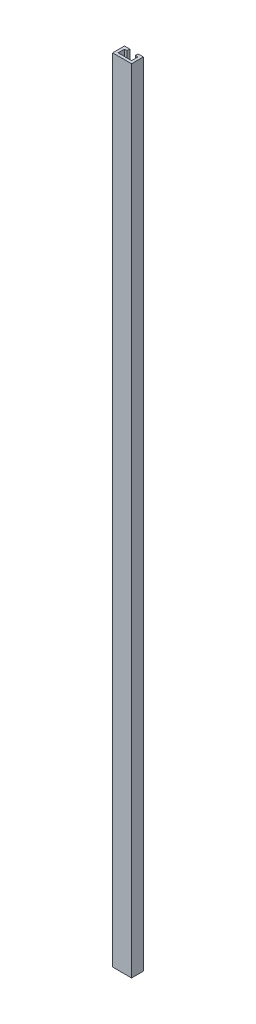
ISO-10303-21;
HEADER;
FILE_DESCRIPTION(('STEP AP214'),'2;1');
FILE_NAME('part.step','',(''),(''),'','','');
FILE_SCHEMA(('AUTOMOTIVE_DESIGN { 1 0 10303 214 1 1 1 1 }'));
ENDSEC;
DATA;
#1=APPLICATION_CONTEXT('core data for automotive mechanical design processes');
#2=APPLICATION_PROTOCOL_DEFINITION('international standard','automotive_design',2000,#1);
#3=PRODUCT_CONTEXT('',#1,'mechanical');
#4=PRODUCT('Part','Part','',(#3));
#5=PRODUCT_RELATED_PRODUCT_CATEGORY('part','',(#4));
#6=PRODUCT_DEFINITION_FORMATION('','',#4);
#7=PRODUCT_DEFINITION_CONTEXT('part definition',#1,'design');
#8=PRODUCT_DEFINITION('design','',#6,#7);
#9=PRODUCT_DEFINITION_SHAPE('','',#8);
#10=(LENGTH_UNIT() NAMED_UNIT(*) SI_UNIT(.MILLI.,.METRE.));
#11=(NAMED_UNIT(*) PLANE_ANGLE_UNIT() SI_UNIT($,.RADIAN.));
#12=(NAMED_UNIT(*) SI_UNIT($,.STERADIAN.) SOLID_ANGLE_UNIT());
#13=UNCERTAINTY_MEASURE_WITH_UNIT(LENGTH_MEASURE(1.E-05),#10,'distance_accuracy_value','');
#14=(GEOMETRIC_REPRESENTATION_CONTEXT(3) GLOBAL_UNCERTAINTY_ASSIGNED_CONTEXT((#13)) GLOBAL_UNIT_ASSIGNED_CONTEXT((#10,
#11,#12)) REPRESENTATION_CONTEXT('',''));
#15=CARTESIAN_POINT('',(0.,0.,0.));
#16=DIRECTION('',(0.,0.,1.));
#17=DIRECTION('',(1.,0.,0.));
#18=AXIS2_PLACEMENT_3D('',#15,#16,#17);
#19=CARTESIAN_POINT('',(0.,335.,0.));
#20=DIRECTION('',(1.,0.,0.));
#21=DIRECTION('',(0.,0.,-1.));
#22=AXIS2_PLACEMENT_3D('',#19,#20,#21);
#23=PLANE('',#22);
#24=DIRECTION('',(0.,0.,1.));
#25=VECTOR('',#24,1.);
#26=CARTESIAN_POINT('',(0.,0.,0.));
#27=LINE('',#26,#25);
#28=CARTESIAN_POINT('',(0.,0.,0.));
#29=VERTEX_POINT('',#28);
#30=CARTESIAN_POINT('',(0.,0.,5.));
#31=VERTEX_POINT('',#30);
#32=EDGE_CURVE('E164',#29,#31,#27,.T.);
#33=ORIENTED_EDGE('',*,*,#32,.T.);
#34=DIRECTION('',(0.,-1.,0.));
#35=VECTOR('',#34,1.);
#36=CARTESIAN_POINT('',(0.,335.,5.));
#37=LINE('',#36,#35);
#38=CARTESIAN_POINT('',(0.,335.,5.));
#39=VERTEX_POINT('',#38);
#40=EDGE_CURVE('E11',#39,#31,#37,.T.);
#41=ORIENTED_EDGE('',*,*,#40,.F.);
#42=DIRECTION('',(0.,0.,1.));
#43=VECTOR('',#42,1.);
#44=CARTESIAN_POINT('',(0.,335.,0.));
#45=LINE('',#44,#43);
#46=CARTESIAN_POINT('',(0.,335.,0.));
#47=VERTEX_POINT('',#46);
#48=EDGE_CURVE('E198',#47,#39,#45,.T.);
#49=ORIENTED_EDGE('',*,*,#48,.F.);
#50=DIRECTION('',(0.,-1.,0.));
#51=VECTOR('',#50,1.);
#52=CARTESIAN_POINT('',(0.,335.,0.));
#53=LINE('',#52,#51);
#54=EDGE_CURVE('E160',#47,#29,#53,.T.);
#55=ORIENTED_EDGE('',*,*,#54,.T.);
#56=EDGE_LOOP('',(#33,#41,#49,#55));
#57=FACE_BOUND('',#56,.T.);
#58=ADVANCED_FACE('F39',(#57),#23,.F.);
#59=CARTESIAN_POINT('',(0.,335.,5.));
#60=DIRECTION('',(0.,0.,-1.));
#61=DIRECTION('',(-1.,0.,0.));
#62=AXIS2_PLACEMENT_3D('',#59,#60,#61);
#63=PLANE('',#62);
#64=DIRECTION('',(1.,0.,0.));
#65=VECTOR('',#64,1.);
#66=CARTESIAN_POINT('',(0.,0.,5.));
#67=LINE('',#66,#65);
#68=CARTESIAN_POINT('',(8.,0.,5.));
#69=VERTEX_POINT('',#68);
#70=EDGE_CURVE('E168',#31,#69,#67,.T.);
#71=ORIENTED_EDGE('',*,*,#70,.T.);
#72=DIRECTION('',(0.,-1.,0.));
#73=VECTOR('',#72,1.);
#74=CARTESIAN_POINT('',(8.,335.,5.));
#75=LINE('',#74,#73);
#76=CARTESIAN_POINT('',(8.,335.,5.));
#77=VERTEX_POINT('',#76);
#78=EDGE_CURVE('E48',#77,#69,#75,.T.);
#79=ORIENTED_EDGE('',*,*,#78,.F.);
#80=DIRECTION('',(1.,0.,0.));
#81=VECTOR('',#80,1.);
#82=CARTESIAN_POINT('',(0.,335.,5.));
#83=LINE('',#82,#81);
#84=EDGE_CURVE('E111',#39,#77,#83,.T.);
#85=ORIENTED_EDGE('',*,*,#84,.F.);
#86=ORIENTED_EDGE('',*,*,#40,.T.);
#87=EDGE_LOOP('',(#71,#79,#85,#86));
#88=FACE_BOUND('',#87,.T.);
#89=ADVANCED_FACE('F292',(#88),#63,.F.);
#90=CARTESIAN_POINT('',(8.,335.,5.));
#91=DIRECTION('',(-1.,0.,0.));
#92=DIRECTION('',(0.,0.,1.));
#93=AXIS2_PLACEMENT_3D('',#90,#91,#92);
#94=PLANE('',#93);
#95=DIRECTION('',(0.,0.,-1.));
#96=VECTOR('',#95,1.);
#97=CARTESIAN_POINT('',(8.,0.,5.));
#98=LINE('',#97,#96);
#99=CARTESIAN_POINT('',(8.,0.,0.));
#100=VERTEX_POINT('',#99);
#101=EDGE_CURVE('E171',#69,#100,#98,.T.);
#102=ORIENTED_EDGE('',*,*,#101,.T.);
#103=DIRECTION('',(0.,-1.,0.));
#104=VECTOR('',#103,1.);
#105=CARTESIAN_POINT('',(8.,335.,0.));
#106=LINE('',#105,#104);
#107=CARTESIAN_POINT('',(8.,335.,0.));
#108=VERTEX_POINT('',#107);
#109=EDGE_CURVE('E225',#108,#100,#106,.T.);
#110=ORIENTED_EDGE('',*,*,#109,.F.);
#111=DIRECTION('',(0.,0.,-1.));
#112=VECTOR('',#111,1.);
#113=CARTESIAN_POINT('',(8.,335.,5.));
#114=LINE('',#113,#112);
#115=EDGE_CURVE('E235',#77,#108,#114,.T.);
#116=ORIENTED_EDGE('',*,*,#115,.F.);
#117=ORIENTED_EDGE('',*,*,#78,.T.);
#118=EDGE_LOOP('',(#102,#110,#116,#117));
#119=FACE_BOUND('',#118,.T.);
#120=ADVANCED_FACE('F233',(#119),#94,.F.);
#121=CARTESIAN_POINT('',(8.,335.,0.));
#122=DIRECTION('',(0.,0.,1.));
#123=DIRECTION('',(1.,0.,0.));
#124=AXIS2_PLACEMENT_3D('',#121,#122,#123);
#125=PLANE('',#124);
#126=DIRECTION('',(-1.,0.,0.));
#127=VECTOR('',#126,1.);
#128=CARTESIAN_POINT('',(8.,0.,0.));
#129=LINE('',#128,#127);
#130=CARTESIAN_POINT('',(5.75,0.,0.));
#131=VERTEX_POINT('',#130);
#132=EDGE_CURVE('E174',#100,#131,#129,.T.);
#133=ORIENTED_EDGE('',*,*,#132,.T.);
#134=DIRECTION('',(0.,-1.,0.));
#135=VECTOR('',#134,1.);
#136=CARTESIAN_POINT('',(5.75,335.,0.));
#137=LINE('',#136,#135);
#138=CARTESIAN_POINT('',(5.75,335.,0.));
#139=VERTEX_POINT('',#138);
#140=EDGE_CURVE('E221',#139,#131,#137,.T.);
#141=ORIENTED_EDGE('',*,*,#140,.F.);
#142=DIRECTION('',(-1.,0.,0.));
#143=VECTOR('',#142,1.);
#144=CARTESIAN_POINT('',(8.,335.,0.));
#145=LINE('',#144,#143);
#146=EDGE_CURVE('E254',#108,#139,#145,.T.);
#147=ORIENTED_EDGE('',*,*,#146,.F.);
#148=ORIENTED_EDGE('',*,*,#109,.T.);
#149=EDGE_LOOP('',(#133,#141,#147,#148));
#150=FACE_BOUND('',#149,.T.);
#151=ADVANCED_FACE('F244',(#150),#125,.F.);
#152=CARTESIAN_POINT('',(5.75,335.,0.));
#153=DIRECTION('',(1.,0.,0.));
#154=DIRECTION('',(0.,0.,-1.));
#155=AXIS2_PLACEMENT_3D('',#152,#153,#154);
#156=PLANE('',#155);
#157=DIRECTION('',(0.,0.,1.));
#158=VECTOR('',#157,1.);
#159=CARTESIAN_POINT('',(5.75,0.,0.));
#160=LINE('',#159,#158);
#161=CARTESIAN_POINT('',(5.75,0.,1.15));
#162=VERTEX_POINT('',#161);
#163=EDGE_CURVE('E177',#131,#162,#160,.T.);
#164=ORIENTED_EDGE('',*,*,#163,.T.);
#165=DIRECTION('',(0.,-1.,0.));
#166=VECTOR('',#165,1.);
#167=CARTESIAN_POINT('',(5.75,335.,1.15));
#168=LINE('',#167,#166);
#169=CARTESIAN_POINT('',(5.75,335.,1.15));
#170=VERTEX_POINT('',#169);
#171=EDGE_CURVE('E217',#170,#162,#168,.T.);
#172=ORIENTED_EDGE('',*,*,#171,.F.);
#173=DIRECTION('',(0.,0.,1.));
#174=VECTOR('',#173,1.);
#175=CARTESIAN_POINT('',(5.75,335.,0.));
#176=LINE('',#175,#174);
#177=EDGE_CURVE('E250',#139,#170,#176,.T.);
#178=ORIENTED_EDGE('',*,*,#177,.F.);
#179=ORIENTED_EDGE('',*,*,#140,.T.);
#180=EDGE_LOOP('',(#164,#172,#178,#179));
#181=FACE_BOUND('',#180,.T.);
#182=ADVANCED_FACE('F248',(#181),#156,.F.);
#183=CARTESIAN_POINT('',(5.75,335.,1.15));
#184=DIRECTION('',(0.,0.,-1.));
#185=DIRECTION('',(-1.,0.,0.));
#186=AXIS2_PLACEMENT_3D('',#183,#184,#185);
#187=PLANE('',#186);
#188=DIRECTION('',(1.,0.,0.));
#189=VECTOR('',#188,1.);
#190=CARTESIAN_POINT('',(5.75,0.,1.15));
#191=LINE('',#190,#189);
#192=CARTESIAN_POINT('',(6.85,0.,1.15));
#193=VERTEX_POINT('',#192);
#194=EDGE_CURVE('E180',#162,#193,#191,.T.);
#195=ORIENTED_EDGE('',*,*,#194,.T.);
#196=DIRECTION('',(0.,-1.,0.));
#197=VECTOR('',#196,1.);
#198=CARTESIAN_POINT('',(6.85,335.,1.15));
#199=LINE('',#198,#197);
#200=CARTESIAN_POINT('',(6.85,335.,1.15));
#201=VERTEX_POINT('',#200);
#202=EDGE_CURVE('E213',#201,#193,#199,.T.);
#203=ORIENTED_EDGE('',*,*,#202,.F.);
#204=DIRECTION('',(1.,0.,0.));
#205=VECTOR('',#204,1.);
#206=CARTESIAN_POINT('',(5.75,335.,1.15));
#207=LINE('',#206,#205);
#208=EDGE_CURVE('E253',#170,#201,#207,.T.);
#209=ORIENTED_EDGE('',*,*,#208,.F.);
#210=ORIENTED_EDGE('',*,*,#171,.T.);
#211=EDGE_LOOP('',(#195,#203,#209,#210));
#212=FACE_BOUND('',#211,.T.);
#213=ADVANCED_FACE('F305',(#212),#187,.F.);
#214=CARTESIAN_POINT('',(6.85,335.,1.15));
#215=DIRECTION('',(1.,0.,0.));
#216=DIRECTION('',(0.,0.,-1.));
#217=AXIS2_PLACEMENT_3D('',#214,#215,#216);
#218=PLANE('',#217);
#219=DIRECTION('',(0.,0.,1.));
#220=VECTOR('',#219,1.);
#221=CARTESIAN_POINT('',(6.85,0.,1.15));
#222=LINE('',#221,#220);
#223=CARTESIAN_POINT('',(6.85,0.,3.85));
#224=VERTEX_POINT('',#223);
#225=EDGE_CURVE('E183',#193,#224,#222,.T.);
#226=ORIENTED_EDGE('',*,*,#225,.T.);
#227=DIRECTION('',(0.,-1.,0.));
#228=VECTOR('',#227,1.);
#229=CARTESIAN_POINT('',(6.85,335.,3.85));
#230=LINE('',#229,#228);
#231=CARTESIAN_POINT('',(6.85,335.,3.85));
#232=VERTEX_POINT('',#231);
#233=EDGE_CURVE('E209',#232,#224,#230,.T.);
#234=ORIENTED_EDGE('',*,*,#233,.F.);
#235=DIRECTION('',(0.,0.,1.));
#236=VECTOR('',#235,1.);
#237=CARTESIAN_POINT('',(6.85,335.,1.15));
#238=LINE('',#237,#236);
#239=EDGE_CURVE('E258',#201,#232,#238,.T.);
#240=ORIENTED_EDGE('',*,*,#239,.F.);
#241=ORIENTED_EDGE('',*,*,#202,.T.);
#242=EDGE_LOOP('',(#226,#234,#240,#241));
#243=FACE_BOUND('',#242,.T.);
#244=ADVANCED_FACE('F308',(#243),#218,.F.);
#245=CARTESIAN_POINT('',(6.85,335.,3.85));
#246=DIRECTION('',(0.,0.,1.));
#247=DIRECTION('',(1.,0.,0.));
#248=AXIS2_PLACEMENT_3D('',#245,#246,#247);
#249=PLANE('',#248);
#250=DIRECTION('',(-1.,0.,0.));
#251=VECTOR('',#250,1.);
#252=CARTESIAN_POINT('',(6.85,0.,3.85));
#253=LINE('',#252,#251);
#254=CARTESIAN_POINT('',(1.15,0.,3.85));
#255=VERTEX_POINT('',#254);
#256=EDGE_CURVE('E186',#224,#255,#253,.T.);
#257=ORIENTED_EDGE('',*,*,#256,.T.);
#258=DIRECTION('',(0.,-1.,0.));
#259=VECTOR('',#258,1.);
#260=CARTESIAN_POINT('',(1.15,335.,3.85));
#261=LINE('',#260,#259);
#262=CARTESIAN_POINT('',(1.15,335.,3.85));
#263=VERTEX_POINT('',#262);
#264=EDGE_CURVE('E205',#263,#255,#261,.T.);
#265=ORIENTED_EDGE('',*,*,#264,.F.);
#266=DIRECTION('',(-1.,0.,0.));
#267=VECTOR('',#266,1.);
#268=CARTESIAN_POINT('',(6.85,335.,3.85));
#269=LINE('',#268,#267);
#270=EDGE_CURVE('E265',#232,#263,#269,.T.);
#271=ORIENTED_EDGE('',*,*,#270,.F.);
#272=ORIENTED_EDGE('',*,*,#233,.T.);
#273=EDGE_LOOP('',(#257,#265,#271,#272));
#274=FACE_BOUND('',#273,.T.);
#275=ADVANCED_FACE('F273',(#274),#249,.F.);
#276=CARTESIAN_POINT('',(1.15,335.,3.85));
#277=DIRECTION('',(-1.,0.,0.));
#278=DIRECTION('',(0.,0.,1.));
#279=AXIS2_PLACEMENT_3D('',#276,#277,#278);
#280=PLANE('',#279);
#281=DIRECTION('',(0.,0.,-1.));
#282=VECTOR('',#281,1.);
#283=CARTESIAN_POINT('',(1.15,0.,3.85));
#284=LINE('',#283,#282);
#285=CARTESIAN_POINT('',(1.15,0.,1.15));
#286=VERTEX_POINT('',#285);
#287=EDGE_CURVE('E189',#255,#286,#284,.T.);
#288=ORIENTED_EDGE('',*,*,#287,.T.);
#289=DIRECTION('',(0.,-1.,0.));
#290=VECTOR('',#289,1.);
#291=CARTESIAN_POINT('',(1.15,335.,1.15));
#292=LINE('',#291,#290);
#293=CARTESIAN_POINT('',(1.15,335.,1.15));
#294=VERTEX_POINT('',#293);
#295=EDGE_CURVE('E153',#294,#286,#292,.T.);
#296=ORIENTED_EDGE('',*,*,#295,.F.);
#297=DIRECTION('',(0.,0.,-1.));
#298=VECTOR('',#297,1.);
#299=CARTESIAN_POINT('',(1.15,335.,3.85));
#300=LINE('',#299,#298);
#301=EDGE_CURVE('E142',#263,#294,#300,.T.);
#302=ORIENTED_EDGE('',*,*,#301,.F.);
#303=ORIENTED_EDGE('',*,*,#264,.T.);
#304=EDGE_LOOP('',(#288,#296,#302,#303));
#305=FACE_BOUND('',#304,.T.);
#306=ADVANCED_FACE('F277',(#305),#280,.F.);
#307=CARTESIAN_POINT('',(1.15,335.,1.15));
#308=DIRECTION('',(0.,0.,-1.));
#309=DIRECTION('',(-1.,0.,0.));
#310=AXIS2_PLACEMENT_3D('',#307,#308,#309);
#311=PLANE('',#310);
#312=DIRECTION('',(1.,0.,0.));
#313=VECTOR('',#312,1.);
#314=CARTESIAN_POINT('',(1.15,0.,1.15));
#315=LINE('',#314,#313);
#316=CARTESIAN_POINT('',(2.25,0.,1.15));
#317=VERTEX_POINT('',#316);
#318=EDGE_CURVE('E151',#286,#317,#315,.T.);
#319=ORIENTED_EDGE('',*,*,#318,.T.);
#320=DIRECTION('',(0.,-1.,0.));
#321=VECTOR('',#320,1.);
#322=CARTESIAN_POINT('',(2.25,335.,1.15));
#323=LINE('',#322,#321);
#324=CARTESIAN_POINT('',(2.25,335.,1.15));
#325=VERTEX_POINT('',#324);
#326=EDGE_CURVE('E148',#325,#317,#323,.T.);
#327=ORIENTED_EDGE('',*,*,#326,.F.);
#328=DIRECTION('',(1.,0.,0.));
#329=VECTOR('',#328,1.);
#330=CARTESIAN_POINT('',(1.15,335.,1.15));
#331=LINE('',#330,#329);
#332=EDGE_CURVE('E136',#294,#325,#331,.T.);
#333=ORIENTED_EDGE('',*,*,#332,.F.);
#334=ORIENTED_EDGE('',*,*,#295,.T.);
#335=EDGE_LOOP('',(#319,#327,#333,#334));
#336=FACE_BOUND('',#335,.T.);
#337=ADVANCED_FACE('F149',(#336),#311,.F.);
#338=CARTESIAN_POINT('',(2.25,335.,1.15));
#339=DIRECTION('',(-1.,0.,0.));
#340=DIRECTION('',(0.,0.,1.));
#341=AXIS2_PLACEMENT_3D('',#338,#339,#340);
#342=PLANE('',#341);
#343=DIRECTION('',(0.,0.,-1.));
#344=VECTOR('',#343,1.);
#345=CARTESIAN_POINT('',(2.25,0.,1.15));
#346=LINE('',#345,#344);
#347=CARTESIAN_POINT('',(2.25,0.,0.));
#348=VERTEX_POINT('',#347);
#349=EDGE_CURVE('E97',#317,#348,#346,.T.);
#350=ORIENTED_EDGE('',*,*,#349,.T.);
#351=DIRECTION('',(0.,-1.,0.));
#352=VECTOR('',#351,1.);
#353=CARTESIAN_POINT('',(2.25,335.,0.));
#354=LINE('',#353,#352);
#355=CARTESIAN_POINT('',(2.25,335.,0.));
#356=VERTEX_POINT('',#355);
#357=EDGE_CURVE('E154',#356,#348,#354,.T.);
#358=ORIENTED_EDGE('',*,*,#357,.F.);
#359=DIRECTION('',(0.,0.,-1.));
#360=VECTOR('',#359,1.);
#361=CARTESIAN_POINT('',(2.25,335.,1.15));
#362=LINE('',#361,#360);
#363=EDGE_CURVE('E140',#325,#356,#362,.T.);
#364=ORIENTED_EDGE('',*,*,#363,.F.);
#365=ORIENTED_EDGE('',*,*,#326,.T.);
#366=EDGE_LOOP('',(#350,#358,#364,#365));
#367=FACE_BOUND('',#366,.T.);
#368=ADVANCED_FACE('F156',(#367),#342,.F.);
#369=CARTESIAN_POINT('',(2.25,335.,0.));
#370=DIRECTION('',(0.,0.,1.));
#371=DIRECTION('',(1.,0.,0.));
#372=AXIS2_PLACEMENT_3D('',#369,#370,#371);
#373=PLANE('',#372);
#374=DIRECTION('',(-1.,0.,0.));
#375=VECTOR('',#374,1.);
#376=CARTESIAN_POINT('',(2.25,0.,0.));
#377=LINE('',#376,#375);
#378=EDGE_CURVE('E103',#348,#29,#377,.T.);
#379=ORIENTED_EDGE('',*,*,#378,.T.);
#380=ORIENTED_EDGE('',*,*,#54,.F.);
#381=DIRECTION('',(-1.,0.,0.));
#382=VECTOR('',#381,1.);
#383=CARTESIAN_POINT('',(2.25,335.,0.));
#384=LINE('',#383,#382);
#385=EDGE_CURVE('E56',#356,#47,#384,.T.);
#386=ORIENTED_EDGE('',*,*,#385,.F.);
#387=ORIENTED_EDGE('',*,*,#357,.T.);
#388=EDGE_LOOP('',(#379,#380,#386,#387));
#389=FACE_BOUND('',#388,.T.);
#390=ADVANCED_FACE('F281',(#389),#373,.F.);
#391=CARTESIAN_POINT('',(0.,335.,0.));
#392=DIRECTION('',(0.,1.,0.));
#393=DIRECTION('',(0.,0.,1.));
#394=AXIS2_PLACEMENT_3D('',#391,#392,#393);
#395=PLANE('',#394);
#396=ORIENTED_EDGE('',*,*,#48,.T.);
#397=ORIENTED_EDGE('',*,*,#84,.T.);
#398=ORIENTED_EDGE('',*,*,#115,.T.);
#399=ORIENTED_EDGE('',*,*,#146,.T.);
#400=ORIENTED_EDGE('',*,*,#177,.T.);
#401=ORIENTED_EDGE('',*,*,#208,.T.);
#402=ORIENTED_EDGE('',*,*,#239,.T.);
#403=ORIENTED_EDGE('',*,*,#270,.T.);
#404=ORIENTED_EDGE('',*,*,#301,.T.);
#405=ORIENTED_EDGE('',*,*,#332,.T.);
#406=ORIENTED_EDGE('',*,*,#363,.T.);
#407=ORIENTED_EDGE('',*,*,#385,.T.);
#408=EDGE_LOOP('',(#396,#397,#398,#399,#400,#401,#402,#403,#404,#405,#406,#407));
#409=FACE_BOUND('',#408,.T.);
#410=ADVANCED_FACE('F138',(#409),#395,.T.);
#411=CARTESIAN_POINT('',(0.,0.,0.));
#412=DIRECTION('',(0.,1.,0.));
#413=DIRECTION('',(0.,0.,1.));
#414=AXIS2_PLACEMENT_3D('',#411,#412,#413);
#415=PLANE('',#414);
#416=ORIENTED_EDGE('',*,*,#32,.F.);
#417=ORIENTED_EDGE('',*,*,#378,.F.);
#418=ORIENTED_EDGE('',*,*,#349,.F.);
#419=ORIENTED_EDGE('',*,*,#318,.F.);
#420=ORIENTED_EDGE('',*,*,#287,.F.);
#421=ORIENTED_EDGE('',*,*,#256,.F.);
#422=ORIENTED_EDGE('',*,*,#225,.F.);
#423=ORIENTED_EDGE('',*,*,#194,.F.);
#424=ORIENTED_EDGE('',*,*,#163,.F.);
#425=ORIENTED_EDGE('',*,*,#132,.F.);
#426=ORIENTED_EDGE('',*,*,#101,.F.);
#427=ORIENTED_EDGE('',*,*,#70,.F.);
#428=EDGE_LOOP('',(#416,#417,#418,#419,#420,#421,#422,#423,#424,#425,#426,#427));
#429=FACE_BOUND('',#428,.T.);
#430=ADVANCED_FACE('F239',(#429),#415,.F.);
#431=CLOSED_SHELL('',(#58,#89,#120,#151,#182,#213,#244,#275,#306,#337,#368,#390,#410,#430));
#432=MANIFOLD_SOLID_BREP('B2',#431);
#433=ADVANCED_BREP_SHAPE_REPRESENTATION('',(#18,#432),#14);
#434=SHAPE_DEFINITION_REPRESENTATION(#9,#433);
ENDSEC;
END-ISO-10303-21;
